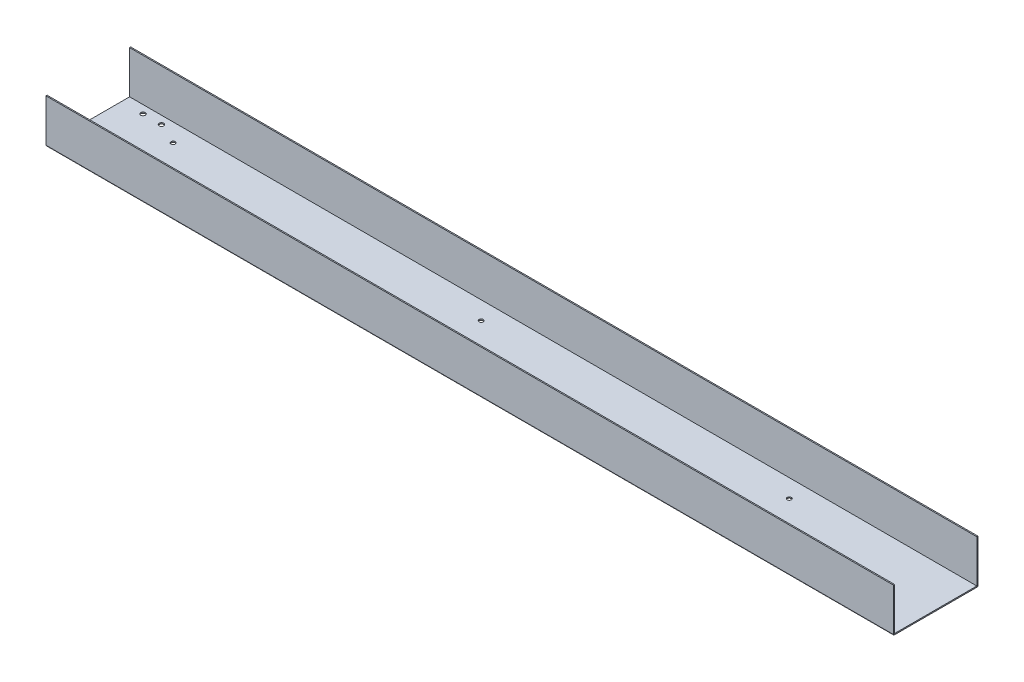
ISO-10303-21;
HEADER;
FILE_DESCRIPTION(('STEP AP214'),'2;1');
FILE_NAME('part.step','',(''),(''),'','','');
FILE_SCHEMA(('AUTOMOTIVE_DESIGN { 1 0 10303 214 1 1 1 1 }'));
ENDSEC;
DATA;
#1=APPLICATION_CONTEXT('core data for automotive mechanical design processes');
#2=APPLICATION_PROTOCOL_DEFINITION('international standard','automotive_design',2000,#1);
#3=PRODUCT_CONTEXT('',#1,'mechanical');
#4=PRODUCT('Part','Part','',(#3));
#5=PRODUCT_RELATED_PRODUCT_CATEGORY('part','',(#4));
#6=PRODUCT_DEFINITION_FORMATION('','',#4);
#7=PRODUCT_DEFINITION_CONTEXT('part definition',#1,'design');
#8=PRODUCT_DEFINITION('design','',#6,#7);
#9=PRODUCT_DEFINITION_SHAPE('','',#8);
#10=(LENGTH_UNIT() NAMED_UNIT(*) SI_UNIT(.MILLI.,.METRE.));
#11=(NAMED_UNIT(*) PLANE_ANGLE_UNIT() SI_UNIT($,.RADIAN.));
#12=(NAMED_UNIT(*) SI_UNIT($,.STERADIAN.) SOLID_ANGLE_UNIT());
#13=UNCERTAINTY_MEASURE_WITH_UNIT(LENGTH_MEASURE(1.E-05),#10,'distance_accuracy_value','');
#14=(GEOMETRIC_REPRESENTATION_CONTEXT(3) GLOBAL_UNCERTAINTY_ASSIGNED_CONTEXT((#13)) GLOBAL_UNIT_ASSIGNED_CONTEXT((#10,
#11,#12)) REPRESENTATION_CONTEXT('',''));
#15=CARTESIAN_POINT('',(0.,0.,0.));
#16=DIRECTION('',(0.,0.,1.));
#17=DIRECTION('',(1.,0.,0.));
#18=AXIS2_PLACEMENT_3D('',#15,#16,#17);
#19=CARTESIAN_POINT('',(-592.530487804878,-1.5,-96.6082317073171));
#20=DIRECTION('',(-1.,0.,0.));
#21=DIRECTION('',(0.,0.,1.));
#22=AXIS2_PLACEMENT_3D('',#19,#20,#21);
#23=PLANE('',#22);
#24=DIRECTION('',(0.,0.,1.));
#25=VECTOR('',#24,1.);
#26=CARTESIAN_POINT('',(-592.530487804878,-1.5,-96.6082317073171));
#27=LINE('',#26,#25);
#28=CARTESIAN_POINT('',(-592.530487804878,-1.5,-40.1082317073171));
#29=VERTEX_POINT('',#28);
#30=CARTESIAN_POINT('',(-592.530487804878,-1.5,66.891768292683));
#31=VERTEX_POINT('',#30);
#32=EDGE_CURVE('E216',#29,#31,#27,.T.);
#33=ORIENTED_EDGE('',*,*,#32,.T.);
#34=DIRECTION('',(0.,1.,0.));
#35=VECTOR('',#34,1.);
#36=CARTESIAN_POINT('',(-592.530487804878,-1.49999999999999,66.8917682926831));
#37=LINE('',#36,#35);
#38=CARTESIAN_POINT('',(-592.530487804878,0.,66.8917682926831));
#39=VERTEX_POINT('',#38);
#40=EDGE_CURVE('E210',#31,#39,#37,.T.);
#41=ORIENTED_EDGE('',*,*,#40,.T.);
#42=DIRECTION('',(0.,0.,1.));
#43=VECTOR('',#42,1.);
#44=CARTESIAN_POINT('',(-592.530487804878,0.,-96.6082317073171));
#45=LINE('',#44,#43);
#46=CARTESIAN_POINT('',(-592.530487804878,0.,-40.1082317073171));
#47=VERTEX_POINT('',#46);
#48=EDGE_CURVE('E195',#47,#39,#45,.T.);
#49=ORIENTED_EDGE('',*,*,#48,.F.);
#50=DIRECTION('',(0.,-1.,0.));
#51=VECTOR('',#50,1.);
#52=CARTESIAN_POINT('',(-592.530487804878,-1.5,-40.1082317073171));
#53=LINE('',#52,#51);
#54=EDGE_CURVE('E204',#47,#29,#53,.T.);
#55=ORIENTED_EDGE('',*,*,#54,.T.);
#56=EDGE_LOOP('',(#33,#41,#49,#55));
#57=FACE_BOUND('',#56,.T.);
#58=ADVANCED_FACE('F46',(#57),#23,.T.);
#59=CARTESIAN_POINT('',(507.469512195122,-1.5,-96.6082317073171));
#60=DIRECTION('',(1.,0.,0.));
#61=DIRECTION('',(0.,0.,-1.));
#62=AXIS2_PLACEMENT_3D('',#59,#60,#61);
#63=PLANE('',#62);
#64=DIRECTION('',(0.,0.,-1.));
#65=VECTOR('',#64,1.);
#66=CARTESIAN_POINT('',(507.469512195122,0.,-96.6082317073171));
#67=LINE('',#66,#65);
#68=CARTESIAN_POINT('',(507.469512195122,0.,66.8917682926829));
#69=VERTEX_POINT('',#68);
#70=CARTESIAN_POINT('',(507.469512195122,0.,-40.1082317073171));
#71=VERTEX_POINT('',#70);
#72=EDGE_CURVE('E219',#69,#71,#67,.T.);
#73=ORIENTED_EDGE('',*,*,#72,.F.);
#74=DIRECTION('',(0.,-1.,0.));
#75=VECTOR('',#74,1.);
#76=CARTESIAN_POINT('',(507.469512195122,-1.49999999999999,66.8917682926829));
#77=LINE('',#76,#75);
#78=CARTESIAN_POINT('',(507.469512195122,-1.5,66.891768292683));
#79=VERTEX_POINT('',#78);
#80=EDGE_CURVE('E12',#69,#79,#77,.T.);
#81=ORIENTED_EDGE('',*,*,#80,.T.);
#82=DIRECTION('',(0.,0.,-1.));
#83=VECTOR('',#82,1.);
#84=CARTESIAN_POINT('',(507.469512195122,-1.5,-96.6082317073171));
#85=LINE('',#84,#83);
#86=CARTESIAN_POINT('',(507.469512195122,-1.5,-40.1082317073171));
#87=VERTEX_POINT('',#86);
#88=EDGE_CURVE('E200',#79,#87,#85,.T.);
#89=ORIENTED_EDGE('',*,*,#88,.T.);
#90=DIRECTION('',(0.,1.,0.));
#91=VECTOR('',#90,1.);
#92=CARTESIAN_POINT('',(507.469512195122,-1.5,-40.1082317073171));
#93=LINE('',#92,#91);
#94=EDGE_CURVE('E199',#87,#71,#93,.T.);
#95=ORIENTED_EDGE('',*,*,#94,.T.);
#96=EDGE_LOOP('',(#73,#81,#89,#95));
#97=FACE_BOUND('',#96,.T.);
#98=ADVANCED_FACE('F48',(#97),#63,.T.);
#99=CARTESIAN_POINT('',(0.,0.,0.));
#100=DIRECTION('',(0.,1.,0.));
#101=DIRECTION('',(0.,0.,1.));
#102=AXIS2_PLACEMENT_3D('',#99,#100,#101);
#103=PLANE('',#102);
#104=CARTESIAN_POINT('',(-512.530487804878,0.,43.391768292683));
#105=DIRECTION('',(0.,1.,0.));
#106=DIRECTION('',(0.,0.,1.));
#107=AXIS2_PLACEMENT_3D('',#104,#105,#106);
#108=CIRCLE('',#107,2.75000000000003);
#109=CARTESIAN_POINT('',(-512.530487804878,0.,46.141768292683));
#110=VERTEX_POINT('',#109);
#111=EDGE_CURVE('E395',#110,#110,#108,.T.);
#112=ORIENTED_EDGE('',*,*,#111,.F.);
#113=EDGE_LOOP('',(#112));
#114=FACE_BOUND('',#113,.T.);
#115=CARTESIAN_POINT('',(-512.530487804878,0.,-16.608231707317));
#116=DIRECTION('',(0.,1.,0.));
#117=DIRECTION('',(0.,0.,1.));
#118=AXIS2_PLACEMENT_3D('',#115,#116,#117);
#119=CIRCLE('',#118,2.75000000000003);
#120=CARTESIAN_POINT('',(-512.530487804878,0.,-13.858231707317));
#121=VERTEX_POINT('',#120);
#122=EDGE_CURVE('E397',#121,#121,#119,.T.);
#123=ORIENTED_EDGE('',*,*,#122,.F.);
#124=EDGE_LOOP('',(#123));
#125=FACE_BOUND('',#124,.T.);
#126=CARTESIAN_POINT('',(-112.530487804878,0.,43.391768292683));
#127=DIRECTION('',(0.,1.,0.));
#128=DIRECTION('',(0.,0.,1.));
#129=AXIS2_PLACEMENT_3D('',#126,#127,#128);
#130=CIRCLE('',#129,2.74999999999999);
#131=CARTESIAN_POINT('',(-112.530487804878,0.,46.141768292683));
#132=VERTEX_POINT('',#131);
#133=EDGE_CURVE('E405',#132,#132,#130,.T.);
#134=ORIENTED_EDGE('',*,*,#133,.F.);
#135=EDGE_LOOP('',(#134));
#136=FACE_BOUND('',#135,.T.);
#137=CARTESIAN_POINT('',(-112.530487804878,0.,-16.608231707317));
#138=DIRECTION('',(0.,1.,0.));
#139=DIRECTION('',(0.,0.,1.));
#140=AXIS2_PLACEMENT_3D('',#137,#138,#139);
#141=CIRCLE('',#140,2.74999999999999);
#142=CARTESIAN_POINT('',(-112.530487804878,0.,-13.858231707317));
#143=VERTEX_POINT('',#142);
#144=EDGE_CURVE('E411',#143,#143,#141,.T.);
#145=ORIENTED_EDGE('',*,*,#144,.F.);
#146=EDGE_LOOP('',(#145));
#147=FACE_BOUND('',#146,.T.);
#148=CARTESIAN_POINT('',(287.469512195122,0.,43.391768292683));
#149=DIRECTION('',(0.,1.,0.));
#150=DIRECTION('',(0.,0.,1.));
#151=AXIS2_PLACEMENT_3D('',#148,#149,#150);
#152=CIRCLE('',#151,2.74999999999997);
#153=CARTESIAN_POINT('',(287.469512195122,0.,46.1417682926829));
#154=VERTEX_POINT('',#153);
#155=EDGE_CURVE('E417',#154,#154,#152,.T.);
#156=ORIENTED_EDGE('',*,*,#155,.F.);
#157=EDGE_LOOP('',(#156));
#158=FACE_BOUND('',#157,.T.);
#159=CARTESIAN_POINT('',(287.469512195122,0.,-16.608231707317));
#160=DIRECTION('',(0.,1.,0.));
#161=DIRECTION('',(0.,0.,1.));
#162=AXIS2_PLACEMENT_3D('',#159,#160,#161);
#163=CIRCLE('',#162,2.74999999999997);
#164=CARTESIAN_POINT('',(287.469512195122,0.,-13.8582317073171));
#165=VERTEX_POINT('',#164);
#166=EDGE_CURVE('E423',#165,#165,#163,.T.);
#167=ORIENTED_EDGE('',*,*,#166,.F.);
#168=EDGE_LOOP('',(#167));
#169=FACE_BOUND('',#168,.T.);
#170=CARTESIAN_POINT('',(-564.580402517152,0.,-29.608231707317));
#171=DIRECTION('',(0.,1.,0.));
#172=DIRECTION('',(0.,0.,1.));
#173=AXIS2_PLACEMENT_3D('',#170,#171,#172);
#174=CIRCLE('',#173,3.00000000000005);
#175=CARTESIAN_POINT('',(-564.580402517152,0.,-26.6082317073169));
#176=VERTEX_POINT('',#175);
#177=EDGE_CURVE('E242',#176,#176,#174,.T.);
#178=ORIENTED_EDGE('',*,*,#177,.F.);
#179=EDGE_LOOP('',(#178));
#180=FACE_BOUND('',#179,.T.);
#181=CARTESIAN_POINT('',(-540.580402517152,0.,-29.608231707317));
#182=DIRECTION('',(0.,1.,0.));
#183=DIRECTION('',(0.,0.,1.));
#184=AXIS2_PLACEMENT_3D('',#181,#182,#183);
#185=CIRCLE('',#184,3.00000000000005);
#186=CARTESIAN_POINT('',(-540.580402517152,0.,-26.6082317073169));
#187=VERTEX_POINT('',#186);
#188=EDGE_CURVE('E232',#187,#187,#185,.T.);
#189=ORIENTED_EDGE('',*,*,#188,.F.);
#190=EDGE_LOOP('',(#189));
#191=FACE_BOUND('',#190,.T.);
#192=CARTESIAN_POINT('',(-540.580402517151,0.,56.391768292683));
#193=DIRECTION('',(0.,1.,0.));
#194=DIRECTION('',(0.,0.,1.));
#195=AXIS2_PLACEMENT_3D('',#192,#193,#194);
#196=CIRCLE('',#195,3.00000000000005);
#197=CARTESIAN_POINT('',(-540.580402517151,0.,59.3917682926831));
#198=VERTEX_POINT('',#197);
#199=EDGE_CURVE('E229',#198,#198,#196,.T.);
#200=ORIENTED_EDGE('',*,*,#199,.F.);
#201=EDGE_LOOP('',(#200));
#202=FACE_BOUND('',#201,.T.);
#203=CARTESIAN_POINT('',(-564.580402517151,0.,56.391768292683));
#204=DIRECTION('',(0.,1.,0.));
#205=DIRECTION('',(0.,0.,1.));
#206=AXIS2_PLACEMENT_3D('',#203,#204,#205);
#207=CIRCLE('',#206,3.00000000000005);
#208=CARTESIAN_POINT('',(-564.580402517151,0.,59.3917682926831));
#209=VERTEX_POINT('',#208);
#210=EDGE_CURVE('E226',#209,#209,#207,.T.);
#211=ORIENTED_EDGE('',*,*,#210,.F.);
#212=EDGE_LOOP('',(#211));
#213=FACE_BOUND('',#212,.T.);
#214=ORIENTED_EDGE('',*,*,#48,.T.);
#215=DIRECTION('',(1.,0.,0.));
#216=VECTOR('',#215,1.);
#217=CARTESIAN_POINT('',(0.,0.,66.891768292683));
#218=LINE('',#217,#216);
#219=EDGE_CURVE('E207',#39,#69,#218,.T.);
#220=ORIENTED_EDGE('',*,*,#219,.T.);
#221=ORIENTED_EDGE('',*,*,#72,.T.);
#222=DIRECTION('',(-1.,0.,0.));
#223=VECTOR('',#222,1.);
#224=CARTESIAN_POINT('',(0.,0.,-40.1082317073171));
#225=LINE('',#224,#223);
#226=EDGE_CURVE('E196',#71,#47,#225,.T.);
#227=ORIENTED_EDGE('',*,*,#226,.T.);
#228=EDGE_LOOP('',(#214,#220,#221,#227));
#229=FACE_BOUND('',#228,.T.);
#230=ADVANCED_FACE('F272',(#114,#125,#136,#147,#158,#169,#180,#191,#202,#213,#229),#103,.T.);
#231=CARTESIAN_POINT('',(0.,-1.5,0.));
#232=DIRECTION('',(0.,1.,0.));
#233=DIRECTION('',(0.,0.,1.));
#234=AXIS2_PLACEMENT_3D('',#231,#232,#233);
#235=PLANE('',#234);
#236=CARTESIAN_POINT('',(-512.530487804878,-1.5,43.391768292683));
#237=DIRECTION('',(0.,1.,0.));
#238=DIRECTION('',(0.,0.,1.));
#239=AXIS2_PLACEMENT_3D('',#236,#237,#238);
#240=CIRCLE('',#239,2.74999999999992);
#241=CARTESIAN_POINT('',(-512.530487804878,-1.5,46.1417682926829));
#242=VERTEX_POINT('',#241);
#243=EDGE_CURVE('E392',#242,#242,#240,.T.);
#244=ORIENTED_EDGE('',*,*,#243,.T.);
#245=EDGE_LOOP('',(#244));
#246=FACE_BOUND('',#245,.T.);
#247=CARTESIAN_POINT('',(-512.530487804878,-1.5,-16.608231707317));
#248=DIRECTION('',(0.,1.,0.));
#249=DIRECTION('',(0.,0.,1.));
#250=AXIS2_PLACEMENT_3D('',#247,#248,#249);
#251=CIRCLE('',#250,2.74999999999992);
#252=CARTESIAN_POINT('',(-512.530487804878,-1.5,-13.8582317073171));
#253=VERTEX_POINT('',#252);
#254=EDGE_CURVE('E402',#253,#253,#251,.T.);
#255=ORIENTED_EDGE('',*,*,#254,.T.);
#256=EDGE_LOOP('',(#255));
#257=FACE_BOUND('',#256,.T.);
#258=CARTESIAN_POINT('',(-112.530487804878,-1.5,43.391768292683));
#259=DIRECTION('',(0.,1.,0.));
#260=DIRECTION('',(0.,0.,1.));
#261=AXIS2_PLACEMENT_3D('',#258,#259,#260);
#262=CIRCLE('',#261,2.74999999999997);
#263=CARTESIAN_POINT('',(-112.530487804878,-1.5,46.1417682926829));
#264=VERTEX_POINT('',#263);
#265=EDGE_CURVE('E408',#264,#264,#262,.T.);
#266=ORIENTED_EDGE('',*,*,#265,.T.);
#267=EDGE_LOOP('',(#266));
#268=FACE_BOUND('',#267,.T.);
#269=CARTESIAN_POINT('',(-112.530487804878,-1.5,-16.608231707317));
#270=DIRECTION('',(0.,1.,0.));
#271=DIRECTION('',(0.,0.,1.));
#272=AXIS2_PLACEMENT_3D('',#269,#270,#271);
#273=CIRCLE('',#272,2.74999999999997);
#274=CARTESIAN_POINT('',(-112.530487804878,-1.5,-13.8582317073171));
#275=VERTEX_POINT('',#274);
#276=EDGE_CURVE('E414',#275,#275,#273,.T.);
#277=ORIENTED_EDGE('',*,*,#276,.T.);
#278=EDGE_LOOP('',(#277));
#279=FACE_BOUND('',#278,.T.);
#280=CARTESIAN_POINT('',(287.469512195122,-1.5,43.391768292683));
#281=DIRECTION('',(0.,1.,0.));
#282=DIRECTION('',(0.,0.,1.));
#283=AXIS2_PLACEMENT_3D('',#280,#281,#282);
#284=CIRCLE('',#283,2.74999999999997);
#285=CARTESIAN_POINT('',(287.469512195122,-1.5,46.1417682926829));
#286=VERTEX_POINT('',#285);
#287=EDGE_CURVE('E420',#286,#286,#284,.T.);
#288=ORIENTED_EDGE('',*,*,#287,.T.);
#289=EDGE_LOOP('',(#288));
#290=FACE_BOUND('',#289,.T.);
#291=CARTESIAN_POINT('',(287.469512195122,-1.5,-16.608231707317));
#292=DIRECTION('',(0.,1.,0.));
#293=DIRECTION('',(0.,0.,1.));
#294=AXIS2_PLACEMENT_3D('',#291,#292,#293);
#295=CIRCLE('',#294,2.74999999999997);
#296=CARTESIAN_POINT('',(287.469512195122,-1.5,-13.8582317073171));
#297=VERTEX_POINT('',#296);
#298=EDGE_CURVE('E425',#297,#297,#295,.T.);
#299=ORIENTED_EDGE('',*,*,#298,.T.);
#300=EDGE_LOOP('',(#299));
#301=FACE_BOUND('',#300,.T.);
#302=CARTESIAN_POINT('',(-564.580402517152,-1.5,-29.608231707317));
#303=DIRECTION('',(0.,1.,0.));
#304=DIRECTION('',(0.,0.,1.));
#305=AXIS2_PLACEMENT_3D('',#302,#303,#304);
#306=CIRCLE('',#305,3.00000000000005);
#307=CARTESIAN_POINT('',(-564.580402517152,-1.5,-26.6082317073169));
#308=VERTEX_POINT('',#307);
#309=EDGE_CURVE('E50',#308,#308,#306,.T.);
#310=ORIENTED_EDGE('',*,*,#309,.T.);
#311=EDGE_LOOP('',(#310));
#312=FACE_BOUND('',#311,.T.);
#313=CARTESIAN_POINT('',(-540.580402517152,-1.5,-29.608231707317));
#314=DIRECTION('',(0.,1.,0.));
#315=DIRECTION('',(0.,0.,1.));
#316=AXIS2_PLACEMENT_3D('',#313,#314,#315);
#317=CIRCLE('',#316,3.00000000000005);
#318=CARTESIAN_POINT('',(-540.580402517152,-1.5,-26.6082317073169));
#319=VERTEX_POINT('',#318);
#320=EDGE_CURVE('E230',#319,#319,#317,.T.);
#321=ORIENTED_EDGE('',*,*,#320,.T.);
#322=EDGE_LOOP('',(#321));
#323=FACE_BOUND('',#322,.T.);
#324=CARTESIAN_POINT('',(-540.580402517151,-1.5,56.391768292683));
#325=DIRECTION('',(0.,1.,0.));
#326=DIRECTION('',(0.,0.,1.));
#327=AXIS2_PLACEMENT_3D('',#324,#325,#326);
#328=CIRCLE('',#327,3.00000000000005);
#329=CARTESIAN_POINT('',(-540.580402517151,-1.5,59.3917682926831));
#330=VERTEX_POINT('',#329);
#331=EDGE_CURVE('E227',#330,#330,#328,.T.);
#332=ORIENTED_EDGE('',*,*,#331,.T.);
#333=EDGE_LOOP('',(#332));
#334=FACE_BOUND('',#333,.T.);
#335=CARTESIAN_POINT('',(-564.580402517151,-1.5,56.391768292683));
#336=DIRECTION('',(0.,1.,0.));
#337=DIRECTION('',(0.,0.,1.));
#338=AXIS2_PLACEMENT_3D('',#335,#336,#337);
#339=CIRCLE('',#338,3.00000000000005);
#340=CARTESIAN_POINT('',(-564.580402517151,-1.5,59.3917682926831));
#341=VERTEX_POINT('',#340);
#342=EDGE_CURVE('E159',#341,#341,#339,.T.);
#343=ORIENTED_EDGE('',*,*,#342,.T.);
#344=EDGE_LOOP('',(#343));
#345=FACE_BOUND('',#344,.T.);
#346=DIRECTION('',(1.,0.,0.));
#347=VECTOR('',#346,1.);
#348=CARTESIAN_POINT('',(0.,-1.5,66.891768292683));
#349=LINE('',#348,#347);
#350=EDGE_CURVE('E55',#31,#79,#349,.T.);
#351=ORIENTED_EDGE('',*,*,#350,.F.);
#352=ORIENTED_EDGE('',*,*,#32,.F.);
#353=DIRECTION('',(-1.,0.,0.));
#354=VECTOR('',#353,1.);
#355=CARTESIAN_POINT('',(0.,-1.5,-40.1082317073171));
#356=LINE('',#355,#354);
#357=EDGE_CURVE('E70',#87,#29,#356,.T.);
#358=ORIENTED_EDGE('',*,*,#357,.F.);
#359=ORIENTED_EDGE('',*,*,#88,.F.);
#360=EDGE_LOOP('',(#351,#352,#358,#359));
#361=FACE_BOUND('',#360,.T.);
#362=ADVANCED_FACE('F293',(#246,#257,#268,#279,#290,#301,#312,#323,#334,#345,#361),#235,.F.);
#363=CARTESIAN_POINT('',(507.469512195122,0.,-41.6082317073171));
#364=DIRECTION('',(1.,0.,0.));
#365=DIRECTION('',(0.,0.,-1.));
#366=AXIS2_PLACEMENT_3D('',#363,#364,#365);
#367=PLANE('',#366);
#368=CARTESIAN_POINT('',(507.469512195122,0.,-40.1082317073171));
#369=DIRECTION('',(-1.,0.,0.));
#370=DIRECTION('',(0.,0.,1.));
#371=AXIS2_PLACEMENT_3D('',#368,#369,#370);
#372=CIRCLE('',#371,1.5);
#373=CARTESIAN_POINT('',(507.469512195122,0.,-41.6082317073171));
#374=VERTEX_POINT('',#373);
#375=EDGE_CURVE('E193',#374,#87,#372,.T.);
#376=ORIENTED_EDGE('',*,*,#375,.F.);
#377=DIRECTION('',(0.,0.,1.));
#378=VECTOR('',#377,1.);
#379=CARTESIAN_POINT('',(507.469512195122,0.,-41.6082317073171));
#380=LINE('',#379,#378);
#381=EDGE_CURVE('E187',#374,#71,#380,.T.);
#382=ORIENTED_EDGE('',*,*,#381,.T.);
#383=ORIENTED_EDGE('',*,*,#94,.F.);
#384=EDGE_LOOP('',(#376,#382,#383));
#385=FACE_BOUND('',#384,.T.);
#386=ADVANCED_FACE('F277',(#385),#367,.T.);
#387=CARTESIAN_POINT('',(-592.530487804878,0.,-40.1082317073171));
#388=DIRECTION('',(-1.,0.,0.));
#389=DIRECTION('',(0.,0.,1.));
#390=AXIS2_PLACEMENT_3D('',#387,#388,#389);
#391=CYLINDRICAL_SURFACE('',#390,1.5);
#392=CARTESIAN_POINT('',(-592.530487804878,0.,-40.1082317073171));
#393=DIRECTION('',(-1.,0.,0.));
#394=DIRECTION('',(0.,0.,1.));
#395=AXIS2_PLACEMENT_3D('',#392,#393,#394);
#396=CIRCLE('',#395,1.5);
#397=CARTESIAN_POINT('',(-592.530487804878,0.,-41.6082317073171));
#398=VERTEX_POINT('',#397);
#399=EDGE_CURVE('E166',#398,#29,#396,.T.);
#400=ORIENTED_EDGE('',*,*,#399,.F.);
#401=DIRECTION('',(-1.,0.,0.));
#402=VECTOR('',#401,1.);
#403=CARTESIAN_POINT('',(0.,0.,-41.6082317073171));
#404=LINE('',#403,#402);
#405=EDGE_CURVE('E167',#374,#398,#404,.T.);
#406=ORIENTED_EDGE('',*,*,#405,.F.);
#407=ORIENTED_EDGE('',*,*,#375,.T.);
#408=ORIENTED_EDGE('',*,*,#357,.T.);
#409=EDGE_LOOP('',(#400,#406,#407,#408));
#410=FACE_BOUND('',#409,.T.);
#411=ADVANCED_FACE('F300',(#410),#391,.T.);
#412=CARTESIAN_POINT('',(-592.530487804878,0.,-41.6082317073171));
#413=DIRECTION('',(-1.,0.,0.));
#414=DIRECTION('',(0.,0.,1.));
#415=AXIS2_PLACEMENT_3D('',#412,#413,#414);
#416=PLANE('',#415);
#417=DIRECTION('',(0.,0.,-1.));
#418=VECTOR('',#417,1.);
#419=CARTESIAN_POINT('',(-592.530487804878,0.,-41.6082317073171));
#420=LINE('',#419,#418);
#421=EDGE_CURVE('E163',#47,#398,#420,.T.);
#422=ORIENTED_EDGE('',*,*,#421,.T.);
#423=ORIENTED_EDGE('',*,*,#399,.T.);
#424=ORIENTED_EDGE('',*,*,#54,.F.);
#425=EDGE_LOOP('',(#422,#423,#424));
#426=FACE_BOUND('',#425,.T.);
#427=ADVANCED_FACE('F314',(#426),#416,.T.);
#428=CARTESIAN_POINT('',(-592.530487804878,55.3219027549038,-41.6082317073169));
#429=DIRECTION('',(0.,1.,0.));
#430=DIRECTION('',(-1.,0.,0.));
#431=AXIS2_PLACEMENT_3D('',#428,#429,#430);
#432=PLANE('',#431);
#433=DIRECTION('',(-1.,0.,0.));
#434=VECTOR('',#433,1.);
#435=CARTESIAN_POINT('',(-592.530487804878,55.3219027549038,-40.1082317073169));
#436=LINE('',#435,#434);
#437=CARTESIAN_POINT('',(507.469512195122,55.3219027549038,-40.1082317073169));
#438=VERTEX_POINT('',#437);
#439=CARTESIAN_POINT('',(-592.530487804878,55.3219027549038,-40.1082317073169));
#440=VERTEX_POINT('',#439);
#441=EDGE_CURVE('E177',#438,#440,#436,.T.);
#442=ORIENTED_EDGE('',*,*,#441,.F.);
#443=DIRECTION('',(0.,0.,1.));
#444=VECTOR('',#443,1.);
#445=CARTESIAN_POINT('',(507.469512195122,55.3219027549038,-41.6082317073169));
#446=LINE('',#445,#444);
#447=CARTESIAN_POINT('',(507.469512195122,55.3219027549038,-41.6082317073169));
#448=VERTEX_POINT('',#447);
#449=EDGE_CURVE('E170',#448,#438,#446,.T.);
#450=ORIENTED_EDGE('',*,*,#449,.F.);
#451=DIRECTION('',(-1.,0.,0.));
#452=VECTOR('',#451,1.);
#453=CARTESIAN_POINT('',(-592.530487804878,55.3219027549038,-41.6082317073169));
#454=LINE('',#453,#452);
#455=CARTESIAN_POINT('',(-592.530487804878,55.3219027549038,-41.6082317073169));
#456=VERTEX_POINT('',#455);
#457=EDGE_CURVE('E184',#448,#456,#454,.T.);
#458=ORIENTED_EDGE('',*,*,#457,.T.);
#459=DIRECTION('',(0.,0.,1.));
#460=VECTOR('',#459,1.);
#461=CARTESIAN_POINT('',(-592.530487804878,55.3219027549038,-41.6082317073169));
#462=LINE('',#461,#460);
#463=EDGE_CURVE('E182',#456,#440,#462,.T.);
#464=ORIENTED_EDGE('',*,*,#463,.T.);
#465=EDGE_LOOP('',(#442,#450,#458,#464));
#466=FACE_BOUND('',#465,.T.);
#467=ADVANCED_FACE('F317',(#466),#432,.T.);
#468=CARTESIAN_POINT('',(0.,-41.2863289524133,-40.1082317073173));
#469=DIRECTION('',(0.,0.,1.));
#470=DIRECTION('',(0.,-1.,0.));
#471=AXIS2_PLACEMENT_3D('',#468,#469,#470);
#472=PLANE('',#471);
#473=ORIENTED_EDGE('',*,*,#226,.F.);
#474=DIRECTION('',(0.,1.,0.));
#475=VECTOR('',#474,1.);
#476=CARTESIAN_POINT('',(507.469512195122,55.3219027549038,-40.1082317073169));
#477=LINE('',#476,#475);
#478=EDGE_CURVE('E180',#71,#438,#477,.T.);
#479=ORIENTED_EDGE('',*,*,#478,.T.);
#480=ORIENTED_EDGE('',*,*,#441,.T.);
#481=DIRECTION('',(0.,-1.,0.));
#482=VECTOR('',#481,1.);
#483=CARTESIAN_POINT('',(-592.530487804878,55.3219027549038,-40.1082317073169));
#484=LINE('',#483,#482);
#485=EDGE_CURVE('E175',#440,#47,#484,.T.);
#486=ORIENTED_EDGE('',*,*,#485,.T.);
#487=EDGE_LOOP('',(#473,#479,#480,#486));
#488=FACE_BOUND('',#487,.T.);
#489=ADVANCED_FACE('F286',(#488),#472,.T.);
#490=CARTESIAN_POINT('',(507.469512195122,55.3219027549038,-41.6082317073169));
#491=DIRECTION('',(1.,0.,0.));
#492=DIRECTION('',(0.,1.,0.));
#493=AXIS2_PLACEMENT_3D('',#490,#491,#492);
#494=PLANE('',#493);
#495=ORIENTED_EDGE('',*,*,#381,.F.);
#496=DIRECTION('',(0.,1.,0.));
#497=VECTOR('',#496,1.);
#498=CARTESIAN_POINT('',(507.469512195122,55.3219027549038,-41.6082317073169));
#499=LINE('',#498,#497);
#500=EDGE_CURVE('E173',#374,#448,#499,.T.);
#501=ORIENTED_EDGE('',*,*,#500,.T.);
#502=ORIENTED_EDGE('',*,*,#449,.T.);
#503=ORIENTED_EDGE('',*,*,#478,.F.);
#504=EDGE_LOOP('',(#495,#501,#502,#503));
#505=FACE_BOUND('',#504,.T.);
#506=ADVANCED_FACE('F281',(#505),#494,.T.);
#507=CARTESIAN_POINT('',(0.,-41.2863289524133,-41.6082317073173));
#508=DIRECTION('',(0.,0.,1.));
#509=DIRECTION('',(0.,-1.,0.));
#510=AXIS2_PLACEMENT_3D('',#507,#508,#509);
#511=PLANE('',#510);
#512=ORIENTED_EDGE('',*,*,#500,.F.);
#513=ORIENTED_EDGE('',*,*,#405,.T.);
#514=DIRECTION('',(0.,-1.,0.));
#515=VECTOR('',#514,1.);
#516=CARTESIAN_POINT('',(-592.530487804878,55.3219027549038,-41.6082317073169));
#517=LINE('',#516,#515);
#518=EDGE_CURVE('E164',#456,#398,#517,.T.);
#519=ORIENTED_EDGE('',*,*,#518,.F.);
#520=ORIENTED_EDGE('',*,*,#457,.F.);
#521=EDGE_LOOP('',(#512,#513,#519,#520));
#522=FACE_BOUND('',#521,.T.);
#523=ADVANCED_FACE('F322',(#522),#511,.F.);
#524=CARTESIAN_POINT('',(-592.530487804878,55.3219027549038,-41.6082317073169));
#525=DIRECTION('',(-1.,0.,0.));
#526=DIRECTION('',(0.,-1.,0.));
#527=AXIS2_PLACEMENT_3D('',#524,#525,#526);
#528=PLANE('',#527);
#529=ORIENTED_EDGE('',*,*,#421,.F.);
#530=ORIENTED_EDGE('',*,*,#485,.F.);
#531=ORIENTED_EDGE('',*,*,#463,.F.);
#532=ORIENTED_EDGE('',*,*,#518,.T.);
#533=EDGE_LOOP('',(#529,#530,#531,#532));
#534=FACE_BOUND('',#533,.T.);
#535=ADVANCED_FACE('F319',(#534),#528,.T.);
#536=CARTESIAN_POINT('',(-592.530487804878,0.,68.391768292683));
#537=DIRECTION('',(-1.,0.,0.));
#538=DIRECTION('',(0.,0.,1.));
#539=AXIS2_PLACEMENT_3D('',#536,#537,#538);
#540=PLANE('',#539);
#541=CARTESIAN_POINT('',(-592.530487804878,0.,66.8917682926831));
#542=DIRECTION('',(1.,0.,0.));
#543=DIRECTION('',(0.,0.,-1.));
#544=AXIS2_PLACEMENT_3D('',#541,#542,#543);
#545=CIRCLE('',#544,1.5);
#546=CARTESIAN_POINT('',(-592.530487804878,0.,68.391768292683));
#547=VERTEX_POINT('',#546);
#548=EDGE_CURVE('E161',#547,#31,#545,.T.);
#549=ORIENTED_EDGE('',*,*,#548,.F.);
#550=DIRECTION('',(0.,0.,-1.));
#551=VECTOR('',#550,1.);
#552=CARTESIAN_POINT('',(-592.530487804878,0.,68.391768292683));
#553=LINE('',#552,#551);
#554=EDGE_CURVE('E150',#547,#39,#553,.T.);
#555=ORIENTED_EDGE('',*,*,#554,.T.);
#556=ORIENTED_EDGE('',*,*,#40,.F.);
#557=EDGE_LOOP('',(#549,#555,#556));
#558=FACE_BOUND('',#557,.T.);
#559=ADVANCED_FACE('F263',(#558),#540,.T.);
#560=CARTESIAN_POINT('',(507.469512195122,0.,66.8917682926829));
#561=DIRECTION('',(1.,0.,0.));
#562=DIRECTION('',(0.,0.,-1.));
#563=AXIS2_PLACEMENT_3D('',#560,#561,#562);
#564=CYLINDRICAL_SURFACE('',#563,1.5);
#565=CARTESIAN_POINT('',(507.469512195122,0.,66.8917682926829));
#566=DIRECTION('',(1.,0.,0.));
#567=DIRECTION('',(0.,0.,-1.));
#568=AXIS2_PLACEMENT_3D('',#565,#566,#567);
#569=CIRCLE('',#568,1.5);
#570=CARTESIAN_POINT('',(507.469512195122,0.,68.3917682926829));
#571=VERTEX_POINT('',#570);
#572=EDGE_CURVE('E144',#571,#79,#569,.T.);
#573=ORIENTED_EDGE('',*,*,#572,.F.);
#574=DIRECTION('',(1.,0.,0.));
#575=VECTOR('',#574,1.);
#576=CARTESIAN_POINT('',(0.,0.,68.391768292683));
#577=LINE('',#576,#575);
#578=EDGE_CURVE('E143',#547,#571,#577,.T.);
#579=ORIENTED_EDGE('',*,*,#578,.F.);
#580=ORIENTED_EDGE('',*,*,#548,.T.);
#581=ORIENTED_EDGE('',*,*,#350,.T.);
#582=EDGE_LOOP('',(#573,#579,#580,#581));
#583=FACE_BOUND('',#582,.T.);
#584=ADVANCED_FACE('F264',(#583),#564,.T.);
#585=CARTESIAN_POINT('',(507.469512195122,0.,68.3917682926829));
#586=DIRECTION('',(1.,0.,0.));
#587=DIRECTION('',(0.,0.,-1.));
#588=AXIS2_PLACEMENT_3D('',#585,#586,#587);
#589=PLANE('',#588);
#590=DIRECTION('',(0.,0.,1.));
#591=VECTOR('',#590,1.);
#592=CARTESIAN_POINT('',(507.469512195122,0.,68.3917682926829));
#593=LINE('',#592,#591);
#594=EDGE_CURVE('E153',#69,#571,#593,.T.);
#595=ORIENTED_EDGE('',*,*,#594,.T.);
#596=ORIENTED_EDGE('',*,*,#572,.T.);
#597=ORIENTED_EDGE('',*,*,#80,.F.);
#598=EDGE_LOOP('',(#595,#596,#597));
#599=FACE_BOUND('',#598,.T.);
#600=ADVANCED_FACE('F268',(#599),#589,.T.);
#601=CARTESIAN_POINT('',(-592.530487804878,55.3219027549037,68.3917682926828));
#602=DIRECTION('',(0.,1.,0.));
#603=DIRECTION('',(1.,0.,0.));
#604=AXIS2_PLACEMENT_3D('',#601,#602,#603);
#605=PLANE('',#604);
#606=DIRECTION('',(1.,0.,0.));
#607=VECTOR('',#606,1.);
#608=CARTESIAN_POINT('',(-592.530487804878,55.3219027549037,66.8917682926828));
#609=LINE('',#608,#607);
#610=CARTESIAN_POINT('',(-592.530487804878,55.3219027549037,66.8917682926828));
#611=VERTEX_POINT('',#610);
#612=CARTESIAN_POINT('',(507.469512195122,55.3219027549038,66.8917682926827));
#613=VERTEX_POINT('',#612);
#614=EDGE_CURVE('E253',#611,#613,#609,.T.);
#615=ORIENTED_EDGE('',*,*,#614,.F.);
#616=DIRECTION('',(0.,0.,-1.));
#617=VECTOR('',#616,1.);
#618=CARTESIAN_POINT('',(-592.530487804878,55.3219027549037,68.3917682926828));
#619=LINE('',#618,#617);
#620=CARTESIAN_POINT('',(-592.530487804878,55.3219027549037,68.3917682926828));
#621=VERTEX_POINT('',#620);
#622=EDGE_CURVE('E149',#621,#611,#619,.T.);
#623=ORIENTED_EDGE('',*,*,#622,.F.);
#624=DIRECTION('',(1.,0.,0.));
#625=VECTOR('',#624,1.);
#626=CARTESIAN_POINT('',(-592.530487804878,55.3219027549037,68.3917682926828));
#627=LINE('',#626,#625);
#628=CARTESIAN_POINT('',(507.469512195122,55.3219027549038,68.3917682926827));
#629=VERTEX_POINT('',#628);
#630=EDGE_CURVE('E137',#621,#629,#627,.T.);
#631=ORIENTED_EDGE('',*,*,#630,.T.);
#632=DIRECTION('',(0.,0.,-1.));
#633=VECTOR('',#632,1.);
#634=CARTESIAN_POINT('',(507.469512195122,55.3219027549038,68.3917682926827));
#635=LINE('',#634,#633);
#636=EDGE_CURVE('E125',#629,#613,#635,.T.);
#637=ORIENTED_EDGE('',*,*,#636,.T.);
#638=EDGE_LOOP('',(#615,#623,#631,#637));
#639=FACE_BOUND('',#638,.T.);
#640=ADVANCED_FACE('F147',(#639),#605,.T.);
#641=CARTESIAN_POINT('',(0.,-68.0698655377792,66.8917682926832));
#642=DIRECTION('',(0.,0.,-1.));
#643=DIRECTION('',(0.,1.,0.));
#644=AXIS2_PLACEMENT_3D('',#641,#642,#643);
#645=PLANE('',#644);
#646=ORIENTED_EDGE('',*,*,#219,.F.);
#647=DIRECTION('',(0.,1.,0.));
#648=VECTOR('',#647,1.);
#649=CARTESIAN_POINT('',(-592.530487804878,-164.678097245096,66.8917682926836));
#650=LINE('',#649,#648);
#651=EDGE_CURVE('E136',#39,#611,#650,.T.);
#652=ORIENTED_EDGE('',*,*,#651,.T.);
#653=ORIENTED_EDGE('',*,*,#614,.T.);
#654=DIRECTION('',(0.,-1.,0.));
#655=VECTOR('',#654,1.);
#656=CARTESIAN_POINT('',(507.469512195122,-164.678097245096,66.8917682926835));
#657=LINE('',#656,#655);
#658=EDGE_CURVE('E131',#613,#69,#657,.T.);
#659=ORIENTED_EDGE('',*,*,#658,.T.);
#660=EDGE_LOOP('',(#646,#652,#653,#659));
#661=FACE_BOUND('',#660,.T.);
#662=ADVANCED_FACE('F256',(#661),#645,.T.);
#663=CARTESIAN_POINT('',(-592.530487804878,-164.678097245096,68.3917682926836));
#664=DIRECTION('',(-1.,0.,0.));
#665=DIRECTION('',(0.,1.,0.));
#666=AXIS2_PLACEMENT_3D('',#663,#664,#665);
#667=PLANE('',#666);
#668=ORIENTED_EDGE('',*,*,#554,.F.);
#669=DIRECTION('',(0.,1.,0.));
#670=VECTOR('',#669,1.);
#671=CARTESIAN_POINT('',(-592.530487804878,-164.678097245096,68.3917682926836));
#672=LINE('',#671,#670);
#673=EDGE_CURVE('E250',#547,#621,#672,.T.);
#674=ORIENTED_EDGE('',*,*,#673,.T.);
#675=ORIENTED_EDGE('',*,*,#622,.T.);
#676=ORIENTED_EDGE('',*,*,#651,.F.);
#677=EDGE_LOOP('',(#668,#674,#675,#676));
#678=FACE_BOUND('',#677,.T.);
#679=ADVANCED_FACE('F259',(#678),#667,.T.);
#680=CARTESIAN_POINT('',(0.,-68.0698655377792,68.3917682926832));
#681=DIRECTION('',(0.,0.,-1.));
#682=DIRECTION('',(0.,1.,0.));
#683=AXIS2_PLACEMENT_3D('',#680,#681,#682);
#684=PLANE('',#683);
#685=ORIENTED_EDGE('',*,*,#673,.F.);
#686=ORIENTED_EDGE('',*,*,#578,.T.);
#687=DIRECTION('',(0.,-1.,0.));
#688=VECTOR('',#687,1.);
#689=CARTESIAN_POINT('',(507.469512195122,-164.678097245096,68.3917682926835));
#690=LINE('',#689,#688);
#691=EDGE_CURVE('E129',#629,#571,#690,.T.);
#692=ORIENTED_EDGE('',*,*,#691,.F.);
#693=ORIENTED_EDGE('',*,*,#630,.F.);
#694=EDGE_LOOP('',(#685,#686,#692,#693));
#695=FACE_BOUND('',#694,.T.);
#696=ADVANCED_FACE('F141',(#695),#684,.F.);
#697=CARTESIAN_POINT('',(507.469512195122,-164.678097245096,68.3917682926835));
#698=DIRECTION('',(1.,0.,0.));
#699=DIRECTION('',(0.,-1.,0.));
#700=AXIS2_PLACEMENT_3D('',#697,#698,#699);
#701=PLANE('',#700);
#702=ORIENTED_EDGE('',*,*,#594,.F.);
#703=ORIENTED_EDGE('',*,*,#658,.F.);
#704=ORIENTED_EDGE('',*,*,#636,.F.);
#705=ORIENTED_EDGE('',*,*,#691,.T.);
#706=EDGE_LOOP('',(#702,#703,#704,#705));
#707=FACE_BOUND('',#706,.T.);
#708=ADVANCED_FACE('F128',(#707),#701,.T.);
#709=CARTESIAN_POINT('',(-564.580402517151,-10.,56.391768292683));
#710=DIRECTION('',(0.,1.,0.));
#711=DIRECTION('',(0.,0.,1.));
#712=AXIS2_PLACEMENT_3D('',#709,#710,#711);
#713=CYLINDRICAL_SURFACE('',#712,3.00000000000005);
#714=ORIENTED_EDGE('',*,*,#210,.T.);
#715=EDGE_LOOP('',(#714));
#716=FACE_BOUND('',#715,.T.);
#717=ORIENTED_EDGE('',*,*,#342,.F.);
#718=EDGE_LOOP('',(#717));
#719=FACE_BOUND('',#718,.T.);
#720=ADVANCED_FACE('F342',(#716,#719),#713,.F.);
#721=CARTESIAN_POINT('',(-540.580402517151,-10.,56.391768292683));
#722=DIRECTION('',(0.,1.,0.));
#723=DIRECTION('',(0.,0.,1.));
#724=AXIS2_PLACEMENT_3D('',#721,#722,#723);
#725=CYLINDRICAL_SURFACE('',#724,3.00000000000005);
#726=ORIENTED_EDGE('',*,*,#199,.T.);
#727=EDGE_LOOP('',(#726));
#728=FACE_BOUND('',#727,.T.);
#729=ORIENTED_EDGE('',*,*,#331,.F.);
#730=EDGE_LOOP('',(#729));
#731=FACE_BOUND('',#730,.T.);
#732=ADVANCED_FACE('F353',(#728,#731),#725,.F.);
#733=CARTESIAN_POINT('',(-540.580402517152,-10.,-29.608231707317));
#734=DIRECTION('',(0.,1.,0.));
#735=DIRECTION('',(0.,0.,1.));
#736=AXIS2_PLACEMENT_3D('',#733,#734,#735);
#737=CYLINDRICAL_SURFACE('',#736,3.00000000000005);
#738=ORIENTED_EDGE('',*,*,#188,.T.);
#739=EDGE_LOOP('',(#738));
#740=FACE_BOUND('',#739,.T.);
#741=ORIENTED_EDGE('',*,*,#320,.F.);
#742=EDGE_LOOP('',(#741));
#743=FACE_BOUND('',#742,.T.);
#744=ADVANCED_FACE('F357',(#740,#743),#737,.F.);
#745=CARTESIAN_POINT('',(-564.580402517152,-10.,-29.608231707317));
#746=DIRECTION('',(0.,1.,0.));
#747=DIRECTION('',(0.,0.,1.));
#748=AXIS2_PLACEMENT_3D('',#745,#746,#747);
#749=CYLINDRICAL_SURFACE('',#748,3.00000000000005);
#750=ORIENTED_EDGE('',*,*,#177,.T.);
#751=EDGE_LOOP('',(#750));
#752=FACE_BOUND('',#751,.T.);
#753=ORIENTED_EDGE('',*,*,#309,.F.);
#754=EDGE_LOOP('',(#753));
#755=FACE_BOUND('',#754,.T.);
#756=ADVANCED_FACE('F361',(#752,#755),#749,.F.);
#757=CARTESIAN_POINT('',(287.469512195122,0.,-16.608231707317));
#758=DIRECTION('',(0.,1.,0.));
#759=DIRECTION('',(0.,0.,1.));
#760=AXIS2_PLACEMENT_3D('',#757,#758,#759);
#761=CYLINDRICAL_SURFACE('',#760,2.74999999999997);
#762=ORIENTED_EDGE('',*,*,#298,.F.);
#763=EDGE_LOOP('',(#762));
#764=FACE_BOUND('',#763,.T.);
#765=ORIENTED_EDGE('',*,*,#166,.T.);
#766=EDGE_LOOP('',(#765));
#767=FACE_BOUND('',#766,.T.);
#768=ADVANCED_FACE('F364',(#764,#767),#761,.F.);
#769=CARTESIAN_POINT('',(287.469512195122,0.,43.391768292683));
#770=DIRECTION('',(0.,1.,0.));
#771=DIRECTION('',(0.,0.,1.));
#772=AXIS2_PLACEMENT_3D('',#769,#770,#771);
#773=CYLINDRICAL_SURFACE('',#772,2.74999999999997);
#774=ORIENTED_EDGE('',*,*,#287,.F.);
#775=EDGE_LOOP('',(#774));
#776=FACE_BOUND('',#775,.T.);
#777=ORIENTED_EDGE('',*,*,#155,.T.);
#778=EDGE_LOOP('',(#777));
#779=FACE_BOUND('',#778,.T.);
#780=ADVANCED_FACE('F368',(#776,#779),#773,.F.);
#781=CARTESIAN_POINT('',(-112.530487804878,0.,-16.608231707317));
#782=DIRECTION('',(0.,1.,0.));
#783=DIRECTION('',(0.,0.,1.));
#784=AXIS2_PLACEMENT_3D('',#781,#782,#783);
#785=CYLINDRICAL_SURFACE('',#784,2.74999999999998);
#786=ORIENTED_EDGE('',*,*,#276,.F.);
#787=EDGE_LOOP('',(#786));
#788=FACE_BOUND('',#787,.T.);
#789=ORIENTED_EDGE('',*,*,#144,.T.);
#790=EDGE_LOOP('',(#789));
#791=FACE_BOUND('',#790,.T.);
#792=ADVANCED_FACE('F372',(#788,#791),#785,.F.);
#793=CARTESIAN_POINT('',(-112.530487804878,0.,43.391768292683));
#794=DIRECTION('',(0.,1.,0.));
#795=DIRECTION('',(0.,0.,1.));
#796=AXIS2_PLACEMENT_3D('',#793,#794,#795);
#797=CYLINDRICAL_SURFACE('',#796,2.74999999999998);
#798=ORIENTED_EDGE('',*,*,#265,.F.);
#799=EDGE_LOOP('',(#798));
#800=FACE_BOUND('',#799,.T.);
#801=ORIENTED_EDGE('',*,*,#133,.T.);
#802=EDGE_LOOP('',(#801));
#803=FACE_BOUND('',#802,.T.);
#804=ADVANCED_FACE('F376',(#800,#803),#797,.F.);
#805=CARTESIAN_POINT('',(-512.530487804878,0.,-16.608231707317));
#806=DIRECTION('',(0.,1.,0.));
#807=DIRECTION('',(0.,0.,1.));
#808=AXIS2_PLACEMENT_3D('',#805,#806,#807);
#809=CYLINDRICAL_SURFACE('',#808,2.74999999999997);
#810=ORIENTED_EDGE('',*,*,#254,.F.);
#811=EDGE_LOOP('',(#810));
#812=FACE_BOUND('',#811,.T.);
#813=ORIENTED_EDGE('',*,*,#122,.T.);
#814=EDGE_LOOP('',(#813));
#815=FACE_BOUND('',#814,.T.);
#816=ADVANCED_FACE('F380',(#812,#815),#809,.F.);
#817=CARTESIAN_POINT('',(-512.530487804878,0.,43.391768292683));
#818=DIRECTION('',(0.,1.,0.));
#819=DIRECTION('',(0.,0.,1.));
#820=AXIS2_PLACEMENT_3D('',#817,#818,#819);
#821=CYLINDRICAL_SURFACE('',#820,2.74999999999997);
#822=ORIENTED_EDGE('',*,*,#243,.F.);
#823=EDGE_LOOP('',(#822));
#824=FACE_BOUND('',#823,.T.);
#825=ORIENTED_EDGE('',*,*,#111,.T.);
#826=EDGE_LOOP('',(#825));
#827=FACE_BOUND('',#826,.T.);
#828=ADVANCED_FACE('F384',(#824,#827),#821,.F.);
#829=CLOSED_SHELL('',(#58,#98,#230,#362,#386,#411,#427,#467,#489,#506,#523,#535,#559,#584,#600,
#640,#662,#679,#696,#708,#720,#732,#744,#756,#768,#780,#792,#804,#816,#828));
#830=MANIFOLD_SOLID_BREP('B2',#829);
#831=ADVANCED_BREP_SHAPE_REPRESENTATION('',(#18,#830),#14);
#832=SHAPE_DEFINITION_REPRESENTATION(#9,#831);
ENDSEC;
END-ISO-10303-21;
